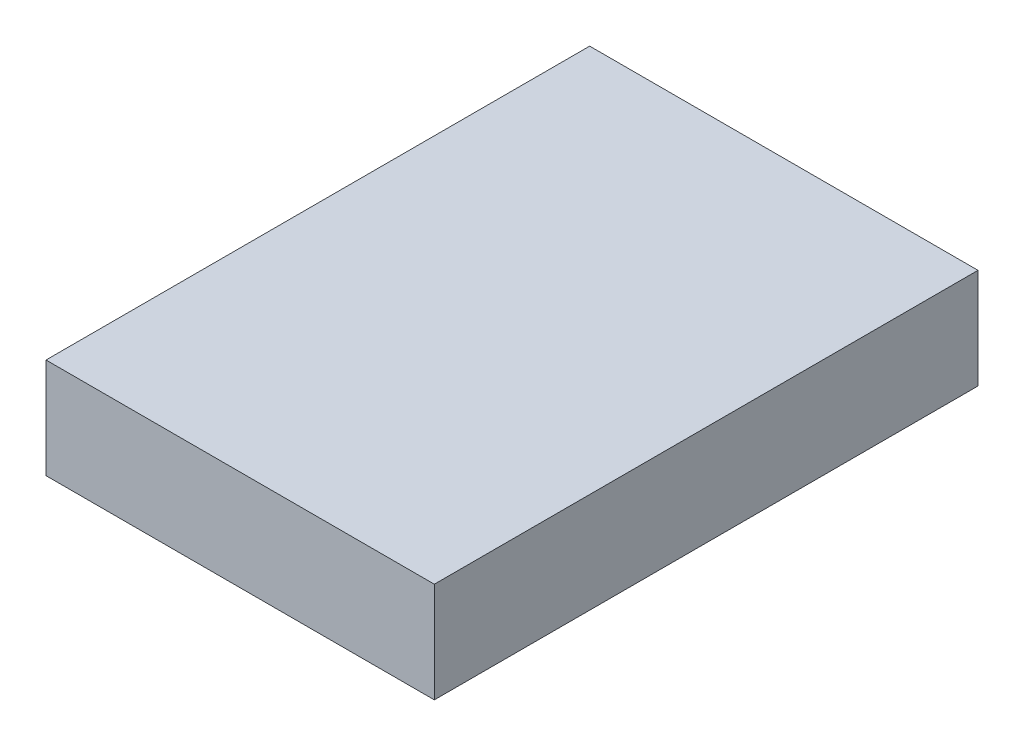
ISO-10303-21;
HEADER;
FILE_DESCRIPTION(('STEP AP214'),'2;1');
FILE_NAME('part.step','',(''),(''),'','','');
FILE_SCHEMA(('AUTOMOTIVE_DESIGN { 1 0 10303 214 1 1 1 1 }'));
ENDSEC;
DATA;
#1=APPLICATION_CONTEXT('core data for automotive mechanical design processes');
#2=APPLICATION_PROTOCOL_DEFINITION('international standard','automotive_design',2000,#1);
#3=PRODUCT_CONTEXT('',#1,'mechanical');
#4=PRODUCT('Part','Part','',(#3));
#5=PRODUCT_RELATED_PRODUCT_CATEGORY('part','',(#4));
#6=PRODUCT_DEFINITION_FORMATION('','',#4);
#7=PRODUCT_DEFINITION_CONTEXT('part definition',#1,'design');
#8=PRODUCT_DEFINITION('design','',#6,#7);
#9=PRODUCT_DEFINITION_SHAPE('','',#8);
#10=(LENGTH_UNIT() NAMED_UNIT(*) SI_UNIT(.MILLI.,.METRE.));
#11=(NAMED_UNIT(*) PLANE_ANGLE_UNIT() SI_UNIT($,.RADIAN.));
#12=(NAMED_UNIT(*) SI_UNIT($,.STERADIAN.) SOLID_ANGLE_UNIT());
#13=UNCERTAINTY_MEASURE_WITH_UNIT(LENGTH_MEASURE(1.E-05),#10,'distance_accuracy_value','');
#14=(GEOMETRIC_REPRESENTATION_CONTEXT(3) GLOBAL_UNCERTAINTY_ASSIGNED_CONTEXT((#13)) GLOBAL_UNIT_ASSIGNED_CONTEXT((#10,
#11,#12)) REPRESENTATION_CONTEXT('',''));
#15=CARTESIAN_POINT('',(0.,0.,0.));
#16=DIRECTION('',(0.,0.,1.));
#17=DIRECTION('',(1.,0.,0.));
#18=AXIS2_PLACEMENT_3D('',#15,#16,#17);
#19=CARTESIAN_POINT('',(0.,16.383,0.));
#20=DIRECTION('',(1.,0.,0.));
#21=DIRECTION('',(0.,0.,-1.));
#22=AXIS2_PLACEMENT_3D('',#19,#20,#21);
#23=PLANE('',#22);
#24=DIRECTION('',(0.,0.,1.));
#25=VECTOR('',#24,1.);
#26=CARTESIAN_POINT('',(0.,0.,0.));
#27=LINE('',#26,#25);
#28=CARTESIAN_POINT('',(0.,0.,-88.9));
#29=VERTEX_POINT('',#28);
#30=CARTESIAN_POINT('',(0.,0.,0.));
#31=VERTEX_POINT('',#30);
#32=EDGE_CURVE('E107',#29,#31,#27,.T.);
#33=ORIENTED_EDGE('',*,*,#32,.T.);
#34=DIRECTION('',(0.,-1.,0.));
#35=VECTOR('',#34,1.);
#36=CARTESIAN_POINT('',(0.,16.383,0.));
#37=LINE('',#36,#35);
#38=CARTESIAN_POINT('',(0.,16.383,0.));
#39=VERTEX_POINT('',#38);
#40=EDGE_CURVE('E11',#39,#31,#37,.T.);
#41=ORIENTED_EDGE('',*,*,#40,.F.);
#42=DIRECTION('',(0.,0.,1.));
#43=VECTOR('',#42,1.);
#44=CARTESIAN_POINT('',(0.,16.383,0.));
#45=LINE('',#44,#43);
#46=CARTESIAN_POINT('',(0.,16.383,-88.9));
#47=VERTEX_POINT('',#46);
#48=EDGE_CURVE('E91',#47,#39,#45,.T.);
#49=ORIENTED_EDGE('',*,*,#48,.F.);
#50=DIRECTION('',(0.,-1.,0.));
#51=VECTOR('',#50,1.);
#52=CARTESIAN_POINT('',(0.,16.383,-88.9));
#53=LINE('',#52,#51);
#54=EDGE_CURVE('E103',#47,#29,#53,.T.);
#55=ORIENTED_EDGE('',*,*,#54,.T.);
#56=EDGE_LOOP('',(#33,#41,#49,#55));
#57=FACE_BOUND('',#56,.T.);
#58=ADVANCED_FACE('F39',(#57),#23,.F.);
#59=CARTESIAN_POINT('',(0.,16.383,0.));
#60=DIRECTION('',(0.,0.,-1.));
#61=DIRECTION('',(-1.,0.,0.));
#62=AXIS2_PLACEMENT_3D('',#59,#60,#61);
#63=PLANE('',#62);
#64=DIRECTION('',(1.,0.,0.));
#65=VECTOR('',#64,1.);
#66=CARTESIAN_POINT('',(0.,0.,0.));
#67=LINE('',#66,#65);
#68=CARTESIAN_POINT('',(63.5,0.,0.));
#69=VERTEX_POINT('',#68);
#70=EDGE_CURVE('E96',#31,#69,#67,.T.);
#71=ORIENTED_EDGE('',*,*,#70,.T.);
#72=DIRECTION('',(0.,-1.,0.));
#73=VECTOR('',#72,1.);
#74=CARTESIAN_POINT('',(63.5,16.383,0.));
#75=LINE('',#74,#73);
#76=CARTESIAN_POINT('',(63.5,16.383,0.));
#77=VERTEX_POINT('',#76);
#78=EDGE_CURVE('E48',#77,#69,#75,.T.);
#79=ORIENTED_EDGE('',*,*,#78,.F.);
#80=DIRECTION('',(1.,0.,0.));
#81=VECTOR('',#80,1.);
#82=CARTESIAN_POINT('',(0.,16.383,0.));
#83=LINE('',#82,#81);
#84=EDGE_CURVE('E86',#39,#77,#83,.T.);
#85=ORIENTED_EDGE('',*,*,#84,.F.);
#86=ORIENTED_EDGE('',*,*,#40,.T.);
#87=EDGE_LOOP('',(#71,#79,#85,#86));
#88=FACE_BOUND('',#87,.T.);
#89=ADVANCED_FACE('F95',(#88),#63,.F.);
#90=CARTESIAN_POINT('',(63.5,16.383,0.));
#91=DIRECTION('',(-1.,0.,0.));
#92=DIRECTION('',(0.,0.,1.));
#93=AXIS2_PLACEMENT_3D('',#90,#91,#92);
#94=PLANE('',#93);
#95=DIRECTION('',(0.,0.,-1.));
#96=VECTOR('',#95,1.);
#97=CARTESIAN_POINT('',(63.5,0.,0.));
#98=LINE('',#97,#96);
#99=CARTESIAN_POINT('',(63.5,0.,-88.9));
#100=VERTEX_POINT('',#99);
#101=EDGE_CURVE('E73',#69,#100,#98,.T.);
#102=ORIENTED_EDGE('',*,*,#101,.T.);
#103=DIRECTION('',(0.,-1.,0.));
#104=VECTOR('',#103,1.);
#105=CARTESIAN_POINT('',(63.5,16.383,-88.9));
#106=LINE('',#105,#104);
#107=CARTESIAN_POINT('',(63.5,16.383,-88.9));
#108=VERTEX_POINT('',#107);
#109=EDGE_CURVE('E98',#108,#100,#106,.T.);
#110=ORIENTED_EDGE('',*,*,#109,.F.);
#111=DIRECTION('',(0.,0.,-1.));
#112=VECTOR('',#111,1.);
#113=CARTESIAN_POINT('',(63.5,16.383,0.));
#114=LINE('',#113,#112);
#115=EDGE_CURVE('E89',#77,#108,#114,.T.);
#116=ORIENTED_EDGE('',*,*,#115,.F.);
#117=ORIENTED_EDGE('',*,*,#78,.T.);
#118=EDGE_LOOP('',(#102,#110,#116,#117));
#119=FACE_BOUND('',#118,.T.);
#120=ADVANCED_FACE('F99',(#119),#94,.F.);
#121=CARTESIAN_POINT('',(0.,16.383,-88.9));
#122=DIRECTION('',(0.,0.,1.));
#123=DIRECTION('',(1.,0.,0.));
#124=AXIS2_PLACEMENT_3D('',#121,#122,#123);
#125=PLANE('',#124);
#126=DIRECTION('',(-1.,0.,0.));
#127=VECTOR('',#126,1.);
#128=CARTESIAN_POINT('',(0.,0.,-88.9));
#129=LINE('',#128,#127);
#130=EDGE_CURVE('E79',#100,#29,#129,.T.);
#131=ORIENTED_EDGE('',*,*,#130,.T.);
#132=ORIENTED_EDGE('',*,*,#54,.F.);
#133=DIRECTION('',(-1.,0.,0.));
#134=VECTOR('',#133,1.);
#135=CARTESIAN_POINT('',(0.,16.383,-88.9));
#136=LINE('',#135,#134);
#137=EDGE_CURVE('E56',#108,#47,#136,.T.);
#138=ORIENTED_EDGE('',*,*,#137,.F.);
#139=ORIENTED_EDGE('',*,*,#109,.T.);
#140=EDGE_LOOP('',(#131,#132,#138,#139));
#141=FACE_BOUND('',#140,.T.);
#142=ADVANCED_FACE('F120',(#141),#125,.F.);
#143=CARTESIAN_POINT('',(0.,16.383,0.));
#144=DIRECTION('',(0.,-1.,0.));
#145=DIRECTION('',(0.,0.,-1.));
#146=AXIS2_PLACEMENT_3D('',#143,#144,#145);
#147=PLANE('',#146);
#148=ORIENTED_EDGE('',*,*,#48,.T.);
#149=ORIENTED_EDGE('',*,*,#84,.T.);
#150=ORIENTED_EDGE('',*,*,#115,.T.);
#151=ORIENTED_EDGE('',*,*,#137,.T.);
#152=EDGE_LOOP('',(#148,#149,#150,#151));
#153=FACE_BOUND('',#152,.T.);
#154=ADVANCED_FACE('F87',(#153),#147,.F.);
#155=CARTESIAN_POINT('',(0.,0.,0.));
#156=DIRECTION('',(0.,-1.,0.));
#157=DIRECTION('',(0.,0.,-1.));
#158=AXIS2_PLACEMENT_3D('',#155,#156,#157);
#159=PLANE('',#158);
#160=ORIENTED_EDGE('',*,*,#32,.F.);
#161=ORIENTED_EDGE('',*,*,#130,.F.);
#162=ORIENTED_EDGE('',*,*,#101,.F.);
#163=ORIENTED_EDGE('',*,*,#70,.F.);
#164=EDGE_LOOP('',(#160,#161,#162,#163));
#165=FACE_BOUND('',#164,.T.);
#166=ADVANCED_FACE('F123',(#165),#159,.T.);
#167=CLOSED_SHELL('',(#58,#89,#120,#142,#154,#166));
#168=MANIFOLD_SOLID_BREP('B2',#167);
#169=ADVANCED_BREP_SHAPE_REPRESENTATION('',(#18,#168),#14);
#170=SHAPE_DEFINITION_REPRESENTATION(#9,#169);
ENDSEC;
END-ISO-10303-21;
